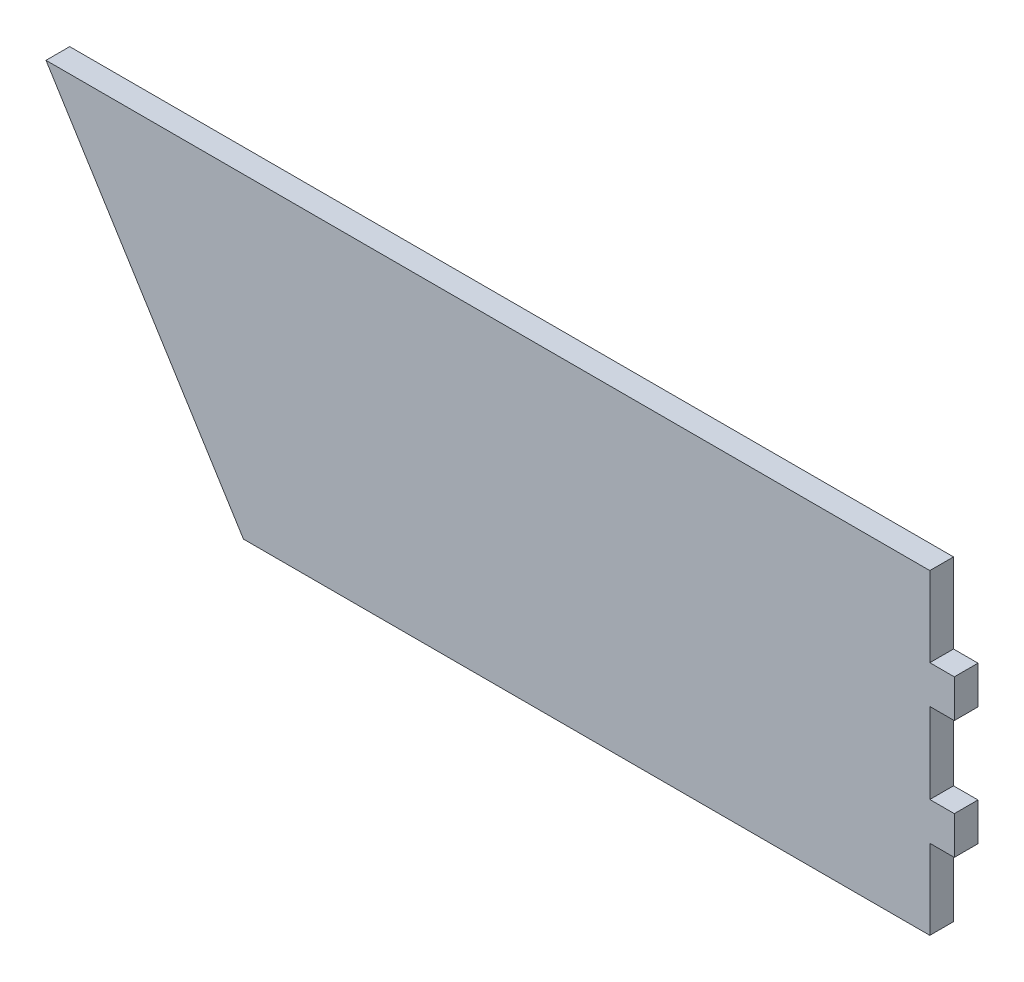
ISO-10303-21;
HEADER;
FILE_DESCRIPTION(('STEP AP214'),'2;1');
FILE_NAME('part.step','',(''),(''),'','','');
FILE_SCHEMA(('AUTOMOTIVE_DESIGN { 1 0 10303 214 1 1 1 1 }'));
ENDSEC;
DATA;
#1=APPLICATION_CONTEXT('core data for automotive mechanical design processes');
#2=APPLICATION_PROTOCOL_DEFINITION('international standard','automotive_design',2000,#1);
#3=PRODUCT_CONTEXT('',#1,'mechanical');
#4=PRODUCT('Part','Part','',(#3));
#5=PRODUCT_RELATED_PRODUCT_CATEGORY('part','',(#4));
#6=PRODUCT_DEFINITION_FORMATION('','',#4);
#7=PRODUCT_DEFINITION_CONTEXT('part definition',#1,'design');
#8=PRODUCT_DEFINITION('design','',#6,#7);
#9=PRODUCT_DEFINITION_SHAPE('','',#8);
#10=(LENGTH_UNIT() NAMED_UNIT(*) SI_UNIT(.MILLI.,.METRE.));
#11=(NAMED_UNIT(*) PLANE_ANGLE_UNIT() SI_UNIT($,.RADIAN.));
#12=(NAMED_UNIT(*) SI_UNIT($,.STERADIAN.) SOLID_ANGLE_UNIT());
#13=UNCERTAINTY_MEASURE_WITH_UNIT(LENGTH_MEASURE(1.E-05),#10,'distance_accuracy_value','');
#14=(GEOMETRIC_REPRESENTATION_CONTEXT(3) GLOBAL_UNCERTAINTY_ASSIGNED_CONTEXT((#13)) GLOBAL_UNIT_ASSIGNED_CONTEXT((#10,
#11,#12)) REPRESENTATION_CONTEXT('',''));
#15=CARTESIAN_POINT('',(0.,0.,0.));
#16=DIRECTION('',(0.,0.,1.));
#17=DIRECTION('',(1.,0.,0.));
#18=AXIS2_PLACEMENT_3D('',#15,#16,#17);
#19=CARTESIAN_POINT('',(115.,0.,3.));
#20=DIRECTION('',(-1.,0.,0.));
#21=DIRECTION('',(0.,0.,1.));
#22=AXIS2_PLACEMENT_3D('',#19,#20,#21);
#23=PLANE('',#22);
#24=DIRECTION('',(0.,0.,1.));
#25=VECTOR('',#24,1.);
#26=CARTESIAN_POINT('',(115.,10.1,3.));
#27=LINE('',#26,#25);
#28=CARTESIAN_POINT('',(115.,10.1,0.));
#29=VERTEX_POINT('',#28);
#30=CARTESIAN_POINT('',(115.,10.1,2.99999999999988));
#31=VERTEX_POINT('',#30);
#32=EDGE_CURVE('E142',#29,#31,#27,.T.);
#33=ORIENTED_EDGE('',*,*,#32,.F.);
#34=DIRECTION('',(0.,1.,0.));
#35=VECTOR('',#34,1.);
#36=CARTESIAN_POINT('',(115.,0.,0.));
#37=LINE('',#36,#35);
#38=CARTESIAN_POINT('',(115.,14.9,0.));
#39=VERTEX_POINT('',#38);
#40=EDGE_CURVE('E239',#29,#39,#37,.T.);
#41=ORIENTED_EDGE('',*,*,#40,.T.);
#42=DIRECTION('',(0.,0.,-1.));
#43=VECTOR('',#42,1.);
#44=CARTESIAN_POINT('',(115.,14.9,3.));
#45=LINE('',#44,#43);
#46=CARTESIAN_POINT('',(115.,14.9,2.99999999999988));
#47=VERTEX_POINT('',#46);
#48=EDGE_CURVE('E218',#47,#39,#45,.T.);
#49=ORIENTED_EDGE('',*,*,#48,.F.);
#50=DIRECTION('',(0.,1.,0.));
#51=VECTOR('',#50,1.);
#52=CARTESIAN_POINT('',(115.,0.,3.));
#53=LINE('',#52,#51);
#54=EDGE_CURVE('E229',#31,#47,#53,.T.);
#55=ORIENTED_EDGE('',*,*,#54,.F.);
#56=EDGE_LOOP('',(#33,#41,#49,#55));
#57=FACE_BOUND('',#56,.T.);
#58=ADVANCED_FACE('F40',(#57),#23,.F.);
#59=DIRECTION('',(0.,0.,1.));
#60=VECTOR('',#59,1.);
#61=CARTESIAN_POINT('',(115.,25.1,3.));
#62=LINE('',#61,#60);
#63=CARTESIAN_POINT('',(115.,25.1,0.));
#64=VERTEX_POINT('',#63);
#65=CARTESIAN_POINT('',(115.,25.1,2.99999999999988));
#66=VERTEX_POINT('',#65);
#67=EDGE_CURVE('E220',#64,#66,#62,.T.);
#68=ORIENTED_EDGE('',*,*,#67,.F.);
#69=CARTESIAN_POINT('',(115.,29.9,0.));
#70=VERTEX_POINT('',#69);
#71=EDGE_CURVE('E225',#64,#70,#37,.T.);
#72=ORIENTED_EDGE('',*,*,#71,.T.);
#73=DIRECTION('',(0.,0.,-1.));
#74=VECTOR('',#73,1.);
#75=CARTESIAN_POINT('',(115.,29.9,3.));
#76=LINE('',#75,#74);
#77=CARTESIAN_POINT('',(115.,29.9,2.99999999999988));
#78=VERTEX_POINT('',#77);
#79=EDGE_CURVE('E216',#78,#70,#76,.T.);
#80=ORIENTED_EDGE('',*,*,#79,.F.);
#81=EDGE_CURVE('E226',#66,#78,#53,.T.);
#82=ORIENTED_EDGE('',*,*,#81,.F.);
#83=EDGE_LOOP('',(#68,#72,#80,#82));
#84=FACE_BOUND('',#83,.T.);
#85=ADVANCED_FACE('F272',(#84),#23,.F.);
#86=CARTESIAN_POINT('',(0.,40.,3.));
#87=DIRECTION('',(0.,-1.,0.));
#88=DIRECTION('',(0.,0.,-1.));
#89=AXIS2_PLACEMENT_3D('',#86,#87,#88);
#90=PLANE('',#89);
#91=DIRECTION('',(0.,0.,1.));
#92=VECTOR('',#91,1.);
#93=CARTESIAN_POINT('',(111.9,40.,2.99999999999961));
#94=LINE('',#93,#92);
#95=CARTESIAN_POINT('',(111.9,40.,0.));
#96=VERTEX_POINT('',#95);
#97=CARTESIAN_POINT('',(111.9,40.,2.99999999999989));
#98=VERTEX_POINT('',#97);
#99=EDGE_CURVE('E153',#96,#98,#94,.T.);
#100=ORIENTED_EDGE('',*,*,#99,.F.);
#101=DIRECTION('',(-1.,0.,0.));
#102=VECTOR('',#101,1.);
#103=CARTESIAN_POINT('',(0.,40.,0.));
#104=LINE('',#103,#102);
#105=CARTESIAN_POINT('',(0.,40.,0.));
#106=VERTEX_POINT('',#105);
#107=EDGE_CURVE('E240',#96,#106,#104,.T.);
#108=ORIENTED_EDGE('',*,*,#107,.T.);
#109=DIRECTION('',(0.,0.,-1.));
#110=VECTOR('',#109,1.);
#111=CARTESIAN_POINT('',(0.,40.,3.));
#112=LINE('',#111,#110);
#113=CARTESIAN_POINT('',(0.,40.,3.));
#114=VERTEX_POINT('',#113);
#115=EDGE_CURVE('E248',#114,#106,#112,.T.);
#116=ORIENTED_EDGE('',*,*,#115,.F.);
#117=DIRECTION('',(-1.,0.,0.));
#118=VECTOR('',#117,1.);
#119=CARTESIAN_POINT('',(0.,40.,3.));
#120=LINE('',#119,#118);
#121=EDGE_CURVE('E231',#98,#114,#120,.T.);
#122=ORIENTED_EDGE('',*,*,#121,.F.);
#123=EDGE_LOOP('',(#100,#108,#116,#122));
#124=FACE_BOUND('',#123,.T.);
#125=ADVANCED_FACE('F283',(#124),#90,.F.);
#126=CARTESIAN_POINT('',(25.,0.,3.));
#127=DIRECTION('',(0.,1.,0.));
#128=DIRECTION('',(-1.,0.,0.));
#129=AXIS2_PLACEMENT_3D('',#126,#127,#128);
#130=PLANE('',#129);
#131=DIRECTION('',(0.,0.,-1.));
#132=VECTOR('',#131,1.);
#133=CARTESIAN_POINT('',(111.9,0.,2.9999999999997));
#134=LINE('',#133,#132);
#135=CARTESIAN_POINT('',(111.9,0.,2.99999999999989));
#136=VERTEX_POINT('',#135);
#137=CARTESIAN_POINT('',(111.9,0.,0.));
#138=VERTEX_POINT('',#137);
#139=EDGE_CURVE('E222',#136,#138,#134,.T.);
#140=ORIENTED_EDGE('',*,*,#139,.F.);
#141=DIRECTION('',(1.,0.,0.));
#142=VECTOR('',#141,1.);
#143=CARTESIAN_POINT('',(25.,0.,3.));
#144=LINE('',#143,#142);
#145=CARTESIAN_POINT('',(25.,0.,3.));
#146=VERTEX_POINT('',#145);
#147=EDGE_CURVE('E150',#146,#136,#144,.T.);
#148=ORIENTED_EDGE('',*,*,#147,.F.);
#149=DIRECTION('',(0.,0.,-1.));
#150=VECTOR('',#149,1.);
#151=CARTESIAN_POINT('',(25.,0.,3.));
#152=LINE('',#151,#150);
#153=CARTESIAN_POINT('',(25.,0.,0.));
#154=VERTEX_POINT('',#153);
#155=EDGE_CURVE('E236',#146,#154,#152,.T.);
#156=ORIENTED_EDGE('',*,*,#155,.T.);
#157=DIRECTION('',(1.,0.,0.));
#158=VECTOR('',#157,1.);
#159=CARTESIAN_POINT('',(25.,0.,0.));
#160=LINE('',#159,#158);
#161=EDGE_CURVE('E230',#154,#138,#160,.T.);
#162=ORIENTED_EDGE('',*,*,#161,.T.);
#163=EDGE_LOOP('',(#140,#148,#156,#162));
#164=FACE_BOUND('',#163,.T.);
#165=ADVANCED_FACE('F291',(#164),#130,.F.);
#166=CARTESIAN_POINT('',(0.,0.,3.));
#167=DIRECTION('',(0.,0.,-1.));
#168=DIRECTION('',(-1.,0.,0.));
#169=AXIS2_PLACEMENT_3D('',#166,#167,#168);
#170=PLANE('',#169);
#171=CARTESIAN_POINT('',(111.9,10.1,2.99999999999989));
#172=CARTESIAN_POINT('',(115.1,10.1,2.99999999999988));
#173=B_SPLINE_CURVE_WITH_KNOTS('',1,(#171,#172),.UNSPECIFIED.,.F.,.F.,(2,2),(0.,
0.119402985074627),.UNSPECIFIED.);
#174=CARTESIAN_POINT('',(111.9,10.1,2.99999999999989));
#175=VERTEX_POINT('',#174);
#176=EDGE_CURVE('E136',#175,#31,#173,.T.);
#177=ORIENTED_EDGE('',*,*,#176,.T.);
#178=ORIENTED_EDGE('',*,*,#54,.T.);
#179=CARTESIAN_POINT('',(115.1,14.9,2.99999999999988));
#180=CARTESIAN_POINT('',(111.9,14.9,2.99999999999989));
#181=B_SPLINE_CURVE_WITH_KNOTS('',1,(#179,#180),.UNSPECIFIED.,.F.,.F.,(2,2),(0.5,
0.619402985074627),.UNSPECIFIED.);
#182=CARTESIAN_POINT('',(111.9,14.9,2.99999999999989));
#183=VERTEX_POINT('',#182);
#184=EDGE_CURVE('E172',#47,#183,#181,.T.);
#185=ORIENTED_EDGE('',*,*,#184,.T.);
#186=CARTESIAN_POINT('',(111.9,14.9,2.99999999999989));
#187=CARTESIAN_POINT('',(111.9,25.1,2.99999999999989));
#188=B_SPLINE_CURVE_WITH_KNOTS('',1,(#186,#187),.UNSPECIFIED.,.F.,.F.,(2,2),(0.619402985074627,
1.),.UNSPECIFIED.);
#189=CARTESIAN_POINT('',(111.9,25.1,2.99999999999989));
#190=VERTEX_POINT('',#189);
#191=EDGE_CURVE('E166',#183,#190,#188,.T.);
#192=ORIENTED_EDGE('',*,*,#191,.T.);
#193=CARTESIAN_POINT('',(111.9,25.1,2.99999999999989));
#194=CARTESIAN_POINT('',(115.1,25.1,2.99999999999988));
#195=B_SPLINE_CURVE_WITH_KNOTS('',1,(#193,#194),.UNSPECIFIED.,.F.,.F.,(2,2),(0.,
0.119402985074627),.UNSPECIFIED.);
#196=EDGE_CURVE('E180',#190,#66,#195,.T.);
#197=ORIENTED_EDGE('',*,*,#196,.T.);
#198=ORIENTED_EDGE('',*,*,#81,.T.);
#199=CARTESIAN_POINT('',(115.1,29.9,2.99999999999988));
#200=CARTESIAN_POINT('',(111.9,29.9,2.99999999999989));
#201=B_SPLINE_CURVE_WITH_KNOTS('',1,(#199,#200),.UNSPECIFIED.,.F.,.F.,(2,2),(0.5,
0.619402985074627),.UNSPECIFIED.);
#202=CARTESIAN_POINT('',(111.9,29.9,2.99999999999989));
#203=VERTEX_POINT('',#202);
#204=EDGE_CURVE('E202',#78,#203,#201,.T.);
#205=ORIENTED_EDGE('',*,*,#204,.T.);
#206=CARTESIAN_POINT('',(111.9,29.9,2.99999999999989));
#207=CARTESIAN_POINT('',(111.9,40.1,2.99999999999989));
#208=B_SPLINE_CURVE_WITH_KNOTS('',1,(#206,#207),.UNSPECIFIED.,.F.,.F.,(2,2),(0.619402985074627,
1.),.UNSPECIFIED.);
#209=EDGE_CURVE('E197',#203,#98,#208,.T.);
#210=ORIENTED_EDGE('',*,*,#209,.T.);
#211=ORIENTED_EDGE('',*,*,#121,.T.);
#212=DIRECTION('',(0.52999894000318,-0.847998304005088,0.));
#213=VECTOR('',#212,1.);
#214=CARTESIAN_POINT('',(0.,40.,3.));
#215=LINE('',#214,#213);
#216=EDGE_CURVE('E233',#114,#146,#215,.T.);
#217=ORIENTED_EDGE('',*,*,#216,.T.);
#218=ORIENTED_EDGE('',*,*,#147,.T.);
#219=CARTESIAN_POINT('',(111.9,-0.0999999999999994,2.99999999999989));
#220=CARTESIAN_POINT('',(111.9,10.1,2.99999999999989));
#221=B_SPLINE_CURVE_WITH_KNOTS('',1,(#219,#220),.UNSPECIFIED.,.F.,.F.,(2,2),(0.619402985074627,
1.),.UNSPECIFIED.);
#222=EDGE_CURVE('E132',#136,#175,#221,.T.);
#223=ORIENTED_EDGE('',*,*,#222,.T.);
#224=EDGE_LOOP('',(#177,#178,#185,#192,#197,#198,#205,#210,#211,#217,#218,#223));
#225=FACE_BOUND('',#224,.T.);
#226=ADVANCED_FACE('F148',(#225),#170,.F.);
#227=CARTESIAN_POINT('',(0.,0.,0.));
#228=DIRECTION('',(0.,0.,-1.));
#229=DIRECTION('',(-1.,0.,0.));
#230=AXIS2_PLACEMENT_3D('',#227,#228,#229);
#231=PLANE('',#230);
#232=ORIENTED_EDGE('',*,*,#40,.F.);
#233=DIRECTION('',(1.,0.,0.));
#234=VECTOR('',#233,1.);
#235=CARTESIAN_POINT('',(111.9,10.1,0.));
#236=LINE('',#235,#234);
#237=CARTESIAN_POINT('',(111.9,10.1,0.));
#238=VERTEX_POINT('',#237);
#239=EDGE_CURVE('E151',#238,#29,#236,.T.);
#240=ORIENTED_EDGE('',*,*,#239,.F.);
#241=DIRECTION('',(0.,-1.,0.));
#242=VECTOR('',#241,1.);
#243=CARTESIAN_POINT('',(111.9,0.,0.));
#244=LINE('',#243,#242);
#245=EDGE_CURVE('E11',#238,#138,#244,.T.);
#246=ORIENTED_EDGE('',*,*,#245,.T.);
#247=ORIENTED_EDGE('',*,*,#161,.F.);
#248=DIRECTION('',(0.52999894000318,-0.847998304005088,0.));
#249=VECTOR('',#248,1.);
#250=CARTESIAN_POINT('',(0.,40.,0.));
#251=LINE('',#250,#249);
#252=EDGE_CURVE('E242',#106,#154,#251,.T.);
#253=ORIENTED_EDGE('',*,*,#252,.F.);
#254=ORIENTED_EDGE('',*,*,#107,.F.);
#255=DIRECTION('',(0.,1.,0.));
#256=VECTOR('',#255,1.);
#257=CARTESIAN_POINT('',(111.9,29.9,0.));
#258=LINE('',#257,#256);
#259=CARTESIAN_POINT('',(111.9,29.9,0.));
#260=VERTEX_POINT('',#259);
#261=EDGE_CURVE('E196',#260,#96,#258,.T.);
#262=ORIENTED_EDGE('',*,*,#261,.F.);
#263=DIRECTION('',(1.,0.,0.));
#264=VECTOR('',#263,1.);
#265=CARTESIAN_POINT('',(0.,29.9,0.));
#266=LINE('',#265,#264);
#267=EDGE_CURVE('E251',#260,#70,#266,.T.);
#268=ORIENTED_EDGE('',*,*,#267,.T.);
#269=ORIENTED_EDGE('',*,*,#71,.F.);
#270=DIRECTION('',(1.,0.,0.));
#271=VECTOR('',#270,1.);
#272=CARTESIAN_POINT('',(111.9,25.1,0.));
#273=LINE('',#272,#271);
#274=CARTESIAN_POINT('',(111.9,25.1,0.));
#275=VERTEX_POINT('',#274);
#276=EDGE_CURVE('E137',#275,#64,#273,.T.);
#277=ORIENTED_EDGE('',*,*,#276,.F.);
#278=DIRECTION('',(0.,1.,0.));
#279=VECTOR('',#278,1.);
#280=CARTESIAN_POINT('',(111.9,14.9,0.));
#281=LINE('',#280,#279);
#282=CARTESIAN_POINT('',(111.9,14.9,0.));
#283=VERTEX_POINT('',#282);
#284=EDGE_CURVE('E171',#283,#275,#281,.T.);
#285=ORIENTED_EDGE('',*,*,#284,.F.);
#286=DIRECTION('',(1.,0.,0.));
#287=VECTOR('',#286,1.);
#288=CARTESIAN_POINT('',(0.,14.9,0.));
#289=LINE('',#288,#287);
#290=EDGE_CURVE('E47',#283,#39,#289,.T.);
#291=ORIENTED_EDGE('',*,*,#290,.T.);
#292=EDGE_LOOP('',(#232,#240,#246,#247,#253,#254,#262,#268,#269,#277,#285,#291));
#293=FACE_BOUND('',#292,.T.);
#294=ADVANCED_FACE('F258',(#293),#231,.T.);
#295=CARTESIAN_POINT('',(0.,40.,3.));
#296=DIRECTION('',(0.847998304005088,0.52999894000318,0.));
#297=DIRECTION('',(-0.52999894000318,0.847998304005088,0.));
#298=AXIS2_PLACEMENT_3D('',#295,#296,#297);
#299=PLANE('',#298);
#300=ORIENTED_EDGE('',*,*,#252,.T.);
#301=ORIENTED_EDGE('',*,*,#155,.F.);
#302=ORIENTED_EDGE('',*,*,#216,.F.);
#303=ORIENTED_EDGE('',*,*,#115,.T.);
#304=EDGE_LOOP('',(#300,#301,#302,#303));
#305=FACE_BOUND('',#304,.T.);
#306=ADVANCED_FACE('F288',(#305),#299,.F.);
#307=CARTESIAN_POINT('',(115.1,29.9,-2.99999999999988));
#308=DIRECTION('',(0.,1.,0.));
#309=DIRECTION('',(1.,0.,0.));
#310=AXIS2_PLACEMENT_3D('',#307,#308,#309);
#311=PLANE('',#310);
#312=ORIENTED_EDGE('',*,*,#79,.T.);
#313=ORIENTED_EDGE('',*,*,#267,.F.);
#314=DIRECTION('',(0.,0.,1.));
#315=VECTOR('',#314,1.);
#316=CARTESIAN_POINT('',(111.9,29.9,-2.99999999999986));
#317=LINE('',#316,#315);
#318=EDGE_CURVE('E62',#260,#203,#317,.T.);
#319=ORIENTED_EDGE('',*,*,#318,.T.);
#320=ORIENTED_EDGE('',*,*,#204,.F.);
#321=EDGE_LOOP('',(#312,#313,#319,#320));
#322=FACE_BOUND('',#321,.T.);
#323=ADVANCED_FACE('F275',(#322),#311,.T.);
#324=CARTESIAN_POINT('',(111.9,29.9,-2.99999999999986));
#325=DIRECTION('',(1.,0.,0.));
#326=DIRECTION('',(0.,0.,-1.));
#327=AXIS2_PLACEMENT_3D('',#324,#325,#326);
#328=PLANE('',#327);
#329=ORIENTED_EDGE('',*,*,#99,.T.);
#330=ORIENTED_EDGE('',*,*,#209,.F.);
#331=ORIENTED_EDGE('',*,*,#318,.F.);
#332=ORIENTED_EDGE('',*,*,#261,.T.);
#333=EDGE_LOOP('',(#329,#330,#331,#332));
#334=FACE_BOUND('',#333,.T.);
#335=ADVANCED_FACE('F280',(#334),#328,.T.);
#336=CARTESIAN_POINT('',(111.9,25.1,-2.99999999999986));
#337=DIRECTION('',(0.,-1.,0.));
#338=DIRECTION('',(-1.,0.,0.));
#339=AXIS2_PLACEMENT_3D('',#336,#337,#338);
#340=PLANE('',#339);
#341=ORIENTED_EDGE('',*,*,#67,.T.);
#342=ORIENTED_EDGE('',*,*,#196,.F.);
#343=DIRECTION('',(0.,0.,1.));
#344=VECTOR('',#343,1.);
#345=CARTESIAN_POINT('',(111.9,25.1,-2.99999999999986));
#346=LINE('',#345,#344);
#347=EDGE_CURVE('E188',#275,#190,#346,.T.);
#348=ORIENTED_EDGE('',*,*,#347,.F.);
#349=ORIENTED_EDGE('',*,*,#276,.T.);
#350=EDGE_LOOP('',(#341,#342,#348,#349));
#351=FACE_BOUND('',#350,.T.);
#352=ADVANCED_FACE('F267',(#351),#340,.T.);
#353=CARTESIAN_POINT('',(115.1,14.9,-2.99999999999988));
#354=DIRECTION('',(0.,1.,0.));
#355=DIRECTION('',(1.,0.,0.));
#356=AXIS2_PLACEMENT_3D('',#353,#354,#355);
#357=PLANE('',#356);
#358=ORIENTED_EDGE('',*,*,#48,.T.);
#359=ORIENTED_EDGE('',*,*,#290,.F.);
#360=DIRECTION('',(0.,0.,1.));
#361=VECTOR('',#360,1.);
#362=CARTESIAN_POINT('',(111.9,14.9,-2.99999999999986));
#363=LINE('',#362,#361);
#364=EDGE_CURVE('E54',#283,#183,#363,.T.);
#365=ORIENTED_EDGE('',*,*,#364,.T.);
#366=ORIENTED_EDGE('',*,*,#184,.F.);
#367=EDGE_LOOP('',(#358,#359,#365,#366));
#368=FACE_BOUND('',#367,.T.);
#369=ADVANCED_FACE('F263',(#368),#357,.T.);
#370=CARTESIAN_POINT('',(111.9,14.9,-2.99999999999986));
#371=DIRECTION('',(1.,0.,0.));
#372=DIRECTION('',(0.,0.,-1.));
#373=AXIS2_PLACEMENT_3D('',#370,#371,#372);
#374=PLANE('',#373);
#375=ORIENTED_EDGE('',*,*,#284,.T.);
#376=ORIENTED_EDGE('',*,*,#347,.T.);
#377=ORIENTED_EDGE('',*,*,#191,.F.);
#378=ORIENTED_EDGE('',*,*,#364,.F.);
#379=EDGE_LOOP('',(#375,#376,#377,#378));
#380=FACE_BOUND('',#379,.T.);
#381=ADVANCED_FACE('F264',(#380),#374,.T.);
#382=CARTESIAN_POINT('',(111.9,10.1,-2.99999999999986));
#383=DIRECTION('',(0.,-1.,0.));
#384=DIRECTION('',(-1.,0.,0.));
#385=AXIS2_PLACEMENT_3D('',#382,#383,#384);
#386=PLANE('',#385);
#387=ORIENTED_EDGE('',*,*,#32,.T.);
#388=ORIENTED_EDGE('',*,*,#176,.F.);
#389=DIRECTION('',(0.,0.,1.));
#390=VECTOR('',#389,1.);
#391=CARTESIAN_POINT('',(111.9,10.1,-2.99999999999986));
#392=LINE('',#391,#390);
#393=EDGE_CURVE('E128',#238,#175,#392,.T.);
#394=ORIENTED_EDGE('',*,*,#393,.F.);
#395=ORIENTED_EDGE('',*,*,#239,.T.);
#396=EDGE_LOOP('',(#387,#388,#394,#395));
#397=FACE_BOUND('',#396,.T.);
#398=ADVANCED_FACE('F140',(#397),#386,.T.);
#399=CARTESIAN_POINT('',(111.9,-0.0999999999999994,-2.99999999999986));
#400=DIRECTION('',(1.,0.,0.));
#401=DIRECTION('',(0.,0.,-1.));
#402=AXIS2_PLACEMENT_3D('',#399,#400,#401);
#403=PLANE('',#402);
#404=ORIENTED_EDGE('',*,*,#139,.T.);
#405=ORIENTED_EDGE('',*,*,#245,.F.);
#406=ORIENTED_EDGE('',*,*,#393,.T.);
#407=ORIENTED_EDGE('',*,*,#222,.F.);
#408=EDGE_LOOP('',(#404,#405,#406,#407));
#409=FACE_BOUND('',#408,.T.);
#410=ADVANCED_FACE('F130',(#409),#403,.T.);
#411=CLOSED_SHELL('',(#58,#85,#125,#165,#226,#294,#306,#323,#335,#352,#369,#381,#398,#410));
#412=MANIFOLD_SOLID_BREP('B2',#411);
#413=ADVANCED_BREP_SHAPE_REPRESENTATION('',(#18,#412),#14);
#414=SHAPE_DEFINITION_REPRESENTATION(#9,#413);
ENDSEC;
END-ISO-10303-21;
